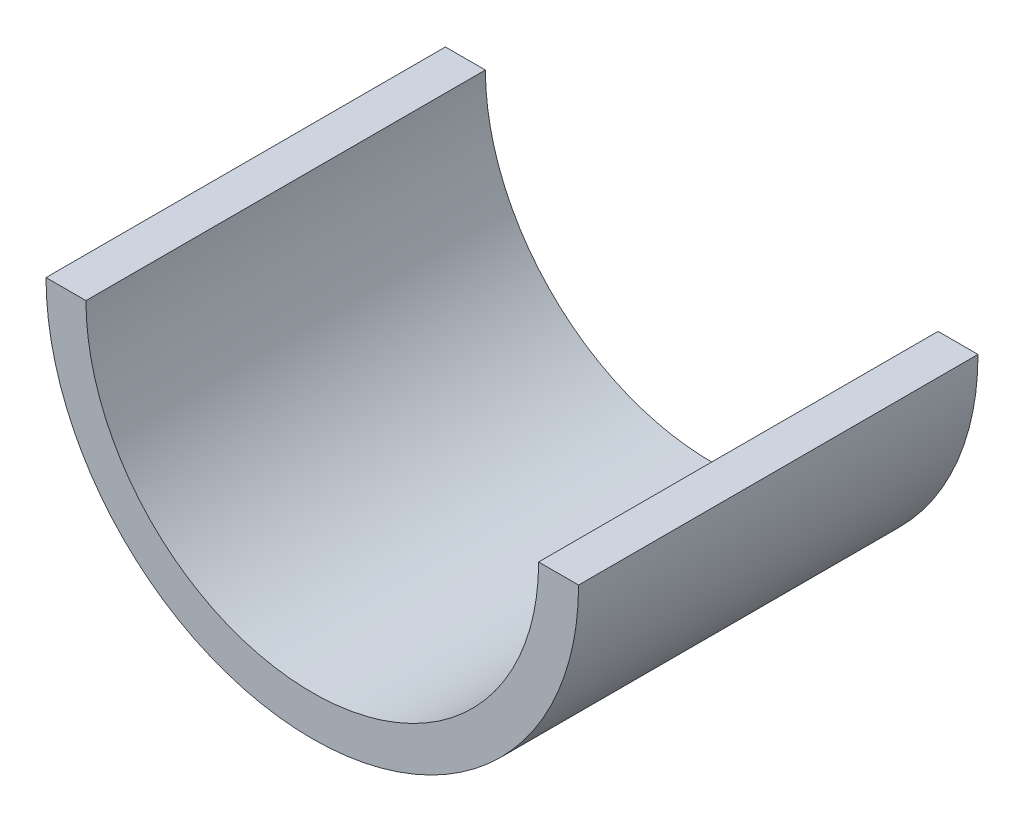
ISO-10303-21;
HEADER;
FILE_DESCRIPTION(('STEP AP214'),'2;1');
FILE_NAME('part.step','',(''),(''),'','','');
FILE_SCHEMA(('AUTOMOTIVE_DESIGN { 1 0 10303 214 1 1 1 1 }'));
ENDSEC;
DATA;
#1=APPLICATION_CONTEXT('core data for automotive mechanical design processes');
#2=APPLICATION_PROTOCOL_DEFINITION('international standard','automotive_design',2000,#1);
#3=PRODUCT_CONTEXT('',#1,'mechanical');
#4=PRODUCT('Part','Part','',(#3));
#5=PRODUCT_RELATED_PRODUCT_CATEGORY('part','',(#4));
#6=PRODUCT_DEFINITION_FORMATION('','',#4);
#7=PRODUCT_DEFINITION_CONTEXT('part definition',#1,'design');
#8=PRODUCT_DEFINITION('design','',#6,#7);
#9=PRODUCT_DEFINITION_SHAPE('','',#8);
#10=(LENGTH_UNIT() NAMED_UNIT(*) SI_UNIT(.MILLI.,.METRE.));
#11=(NAMED_UNIT(*) PLANE_ANGLE_UNIT() SI_UNIT($,.RADIAN.));
#12=(NAMED_UNIT(*) SI_UNIT($,.STERADIAN.) SOLID_ANGLE_UNIT());
#13=UNCERTAINTY_MEASURE_WITH_UNIT(LENGTH_MEASURE(1.E-05),#10,'distance_accuracy_value','');
#14=(GEOMETRIC_REPRESENTATION_CONTEXT(3) GLOBAL_UNCERTAINTY_ASSIGNED_CONTEXT((#13)) GLOBAL_UNIT_ASSIGNED_CONTEXT((#10,
#11,#12)) REPRESENTATION_CONTEXT('',''));
#15=CARTESIAN_POINT('',(0.,0.,0.));
#16=DIRECTION('',(0.,0.,1.));
#17=DIRECTION('',(1.,0.,0.));
#18=AXIS2_PLACEMENT_3D('',#15,#16,#17);
#19=CARTESIAN_POINT('',(10.,0.,15.));
#20=DIRECTION('',(0.,0.,-1.));
#21=DIRECTION('',(-1.,0.,0.));
#22=AXIS2_PLACEMENT_3D('',#19,#20,#21);
#23=CYLINDRICAL_SURFACE('',#22,8.5);
#24=CARTESIAN_POINT('',(10.,0.,0.));
#25=DIRECTION('',(0.,0.,-1.));
#26=DIRECTION('',(1.,0.,0.));
#27=AXIS2_PLACEMENT_3D('',#24,#25,#26);
#28=CIRCLE('',#27,8.5);
#29=CARTESIAN_POINT('',(18.5,0.,0.));
#30=VERTEX_POINT('',#29);
#31=CARTESIAN_POINT('',(1.5,0.,0.));
#32=VERTEX_POINT('',#31);
#33=EDGE_CURVE('E96',#30,#32,#28,.T.);
#34=ORIENTED_EDGE('',*,*,#33,.T.);
#35=DIRECTION('',(0.,0.,-1.));
#36=VECTOR('',#35,1.);
#37=CARTESIAN_POINT('',(1.5,0.,15.));
#38=LINE('',#37,#36);
#39=CARTESIAN_POINT('',(1.5,0.,15.));
#40=VERTEX_POINT('',#39);
#41=EDGE_CURVE('E11',#40,#32,#38,.T.);
#42=ORIENTED_EDGE('',*,*,#41,.F.);
#43=CARTESIAN_POINT('',(10.,0.,15.));
#44=DIRECTION('',(0.,0.,-1.));
#45=DIRECTION('',(1.,0.,0.));
#46=AXIS2_PLACEMENT_3D('',#43,#44,#45);
#47=CIRCLE('',#46,8.5);
#48=CARTESIAN_POINT('',(18.5,0.,15.));
#49=VERTEX_POINT('',#48);
#50=EDGE_CURVE('E84',#49,#40,#47,.T.);
#51=ORIENTED_EDGE('',*,*,#50,.F.);
#52=DIRECTION('',(0.,0.,-1.));
#53=VECTOR('',#52,1.);
#54=CARTESIAN_POINT('',(18.5,0.,15.));
#55=LINE('',#54,#53);
#56=EDGE_CURVE('E92',#49,#30,#55,.T.);
#57=ORIENTED_EDGE('',*,*,#56,.T.);
#58=EDGE_LOOP('',(#34,#42,#51,#57));
#59=FACE_BOUND('',#58,.T.);
#60=ADVANCED_FACE('F33',(#59),#23,.F.);
#61=CARTESIAN_POINT('',(0.,0.,15.));
#62=DIRECTION('',(0.,-1.,0.));
#63=DIRECTION('',(0.,0.,-1.));
#64=AXIS2_PLACEMENT_3D('',#61,#62,#63);
#65=PLANE('',#64);
#66=DIRECTION('',(-1.,0.,0.));
#67=VECTOR('',#66,1.);
#68=CARTESIAN_POINT('',(0.,0.,0.));
#69=LINE('',#68,#67);
#70=CARTESIAN_POINT('',(0.,0.,0.));
#71=VERTEX_POINT('',#70);
#72=EDGE_CURVE('E88',#32,#71,#69,.T.);
#73=ORIENTED_EDGE('',*,*,#72,.T.);
#74=DIRECTION('',(0.,0.,-1.));
#75=VECTOR('',#74,1.);
#76=CARTESIAN_POINT('',(0.,0.,15.));
#77=LINE('',#76,#75);
#78=CARTESIAN_POINT('',(0.,0.,15.));
#79=VERTEX_POINT('',#78);
#80=EDGE_CURVE('E41',#79,#71,#77,.T.);
#81=ORIENTED_EDGE('',*,*,#80,.F.);
#82=DIRECTION('',(-1.,0.,0.));
#83=VECTOR('',#82,1.);
#84=CARTESIAN_POINT('',(0.,0.,15.));
#85=LINE('',#84,#83);
#86=EDGE_CURVE('E79',#40,#79,#85,.T.);
#87=ORIENTED_EDGE('',*,*,#86,.F.);
#88=ORIENTED_EDGE('',*,*,#41,.T.);
#89=EDGE_LOOP('',(#73,#81,#87,#88));
#90=FACE_BOUND('',#89,.T.);
#91=ADVANCED_FACE('F87',(#90),#65,.F.);
#92=CARTESIAN_POINT('',(10.,0.,15.));
#93=DIRECTION('',(0.,0.,-1.));
#94=DIRECTION('',(-1.,0.,0.));
#95=AXIS2_PLACEMENT_3D('',#92,#93,#94);
#96=CYLINDRICAL_SURFACE('',#95,10.);
#97=CARTESIAN_POINT('',(10.,0.,0.));
#98=DIRECTION('',(0.,0.,1.));
#99=DIRECTION('',(1.,0.,0.));
#100=AXIS2_PLACEMENT_3D('',#97,#98,#99);
#101=CIRCLE('',#100,10.);
#102=CARTESIAN_POINT('',(20.,0.,0.));
#103=VERTEX_POINT('',#102);
#104=EDGE_CURVE('E66',#71,#103,#101,.T.);
#105=ORIENTED_EDGE('',*,*,#104,.T.);
#106=DIRECTION('',(0.,0.,-1.));
#107=VECTOR('',#106,1.);
#108=CARTESIAN_POINT('',(20.,0.,15.));
#109=LINE('',#108,#107);
#110=CARTESIAN_POINT('',(20.,0.,15.));
#111=VERTEX_POINT('',#110);
#112=EDGE_CURVE('E89',#111,#103,#109,.T.);
#113=ORIENTED_EDGE('',*,*,#112,.F.);
#114=CARTESIAN_POINT('',(10.,0.,15.));
#115=DIRECTION('',(0.,0.,1.));
#116=DIRECTION('',(1.,0.,0.));
#117=AXIS2_PLACEMENT_3D('',#114,#115,#116);
#118=CIRCLE('',#117,10.);
#119=EDGE_CURVE('E82',#79,#111,#118,.T.);
#120=ORIENTED_EDGE('',*,*,#119,.F.);
#121=ORIENTED_EDGE('',*,*,#80,.T.);
#122=EDGE_LOOP('',(#105,#113,#120,#121));
#123=FACE_BOUND('',#122,.T.);
#124=ADVANCED_FACE('F90',(#123),#96,.T.);
#125=CARTESIAN_POINT('',(18.5,0.,15.));
#126=DIRECTION('',(0.,-1.,0.));
#127=DIRECTION('',(0.,0.,-1.));
#128=AXIS2_PLACEMENT_3D('',#125,#126,#127);
#129=PLANE('',#128);
#130=DIRECTION('',(-1.,0.,0.));
#131=VECTOR('',#130,1.);
#132=CARTESIAN_POINT('',(18.5,0.,0.));
#133=LINE('',#132,#131);
#134=EDGE_CURVE('E72',#103,#30,#133,.T.);
#135=ORIENTED_EDGE('',*,*,#134,.T.);
#136=ORIENTED_EDGE('',*,*,#56,.F.);
#137=DIRECTION('',(-1.,0.,0.));
#138=VECTOR('',#137,1.);
#139=CARTESIAN_POINT('',(18.5,0.,15.));
#140=LINE('',#139,#138);
#141=EDGE_CURVE('E49',#111,#49,#140,.T.);
#142=ORIENTED_EDGE('',*,*,#141,.F.);
#143=ORIENTED_EDGE('',*,*,#112,.T.);
#144=EDGE_LOOP('',(#135,#136,#142,#143));
#145=FACE_BOUND('',#144,.T.);
#146=ADVANCED_FACE('F103',(#145),#129,.F.);
#147=CARTESIAN_POINT('',(10.,0.,15.));
#148=DIRECTION('',(0.,0.,1.));
#149=DIRECTION('',(1.,0.,0.));
#150=AXIS2_PLACEMENT_3D('',#147,#148,#149);
#151=PLANE('',#150);
#152=ORIENTED_EDGE('',*,*,#50,.T.);
#153=ORIENTED_EDGE('',*,*,#86,.T.);
#154=ORIENTED_EDGE('',*,*,#119,.T.);
#155=ORIENTED_EDGE('',*,*,#141,.T.);
#156=EDGE_LOOP('',(#152,#153,#154,#155));
#157=FACE_BOUND('',#156,.T.);
#158=ADVANCED_FACE('F80',(#157),#151,.T.);
#159=CARTESIAN_POINT('',(10.,0.,0.));
#160=DIRECTION('',(0.,0.,1.));
#161=DIRECTION('',(1.,0.,0.));
#162=AXIS2_PLACEMENT_3D('',#159,#160,#161);
#163=PLANE('',#162);
#164=ORIENTED_EDGE('',*,*,#33,.F.);
#165=ORIENTED_EDGE('',*,*,#134,.F.);
#166=ORIENTED_EDGE('',*,*,#104,.F.);
#167=ORIENTED_EDGE('',*,*,#72,.F.);
#168=EDGE_LOOP('',(#164,#165,#166,#167));
#169=FACE_BOUND('',#168,.T.);
#170=ADVANCED_FACE('F106',(#169),#163,.F.);
#171=CLOSED_SHELL('',(#60,#91,#124,#146,#158,#170));
#172=MANIFOLD_SOLID_BREP('B2',#171);
#173=ADVANCED_BREP_SHAPE_REPRESENTATION('',(#18,#172),#14);
#174=SHAPE_DEFINITION_REPRESENTATION(#9,#173);
ENDSEC;
END-ISO-10303-21;
